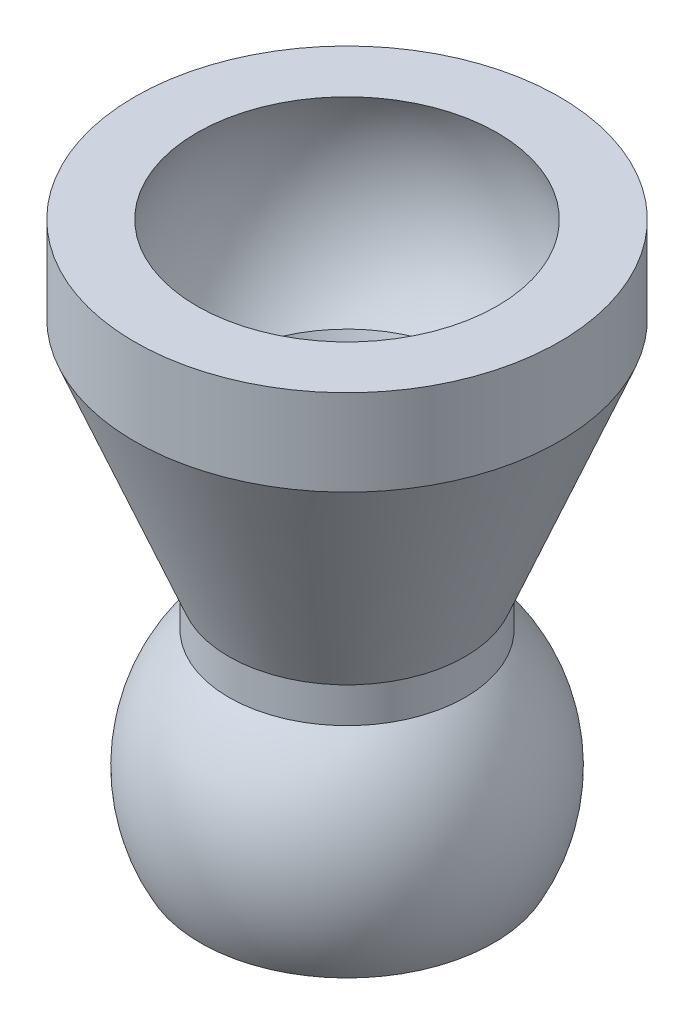
ISO-10303-21;
HEADER;
FILE_DESCRIPTION(('STEP AP214'),'2;1');
FILE_NAME('part.step','',(''),(''),'','','');
FILE_SCHEMA(('AUTOMOTIVE_DESIGN { 1 0 10303 214 1 1 1 1 }'));
ENDSEC;
DATA;
#1=APPLICATION_CONTEXT('core data for automotive mechanical design processes');
#2=APPLICATION_PROTOCOL_DEFINITION('international standard','automotive_design',2000,#1);
#3=PRODUCT_CONTEXT('',#1,'mechanical');
#4=PRODUCT('Part','Part','',(#3));
#5=PRODUCT_RELATED_PRODUCT_CATEGORY('part','',(#4));
#6=PRODUCT_DEFINITION_FORMATION('','',#4);
#7=PRODUCT_DEFINITION_CONTEXT('part definition',#1,'design');
#8=PRODUCT_DEFINITION('design','',#6,#7);
#9=PRODUCT_DEFINITION_SHAPE('','',#8);
#10=(LENGTH_UNIT() NAMED_UNIT(*) SI_UNIT(.MILLI.,.METRE.));
#11=(NAMED_UNIT(*) PLANE_ANGLE_UNIT() SI_UNIT($,.RADIAN.));
#12=(NAMED_UNIT(*) SI_UNIT($,.STERADIAN.) SOLID_ANGLE_UNIT());
#13=UNCERTAINTY_MEASURE_WITH_UNIT(LENGTH_MEASURE(1.E-05),#10,'distance_accuracy_value','');
#14=(GEOMETRIC_REPRESENTATION_CONTEXT(3) GLOBAL_UNCERTAINTY_ASSIGNED_CONTEXT((#13)) GLOBAL_UNIT_ASSIGNED_CONTEXT((#10,
#11,#12)) REPRESENTATION_CONTEXT('',''));
#15=CARTESIAN_POINT('',(0.,0.,0.));
#16=DIRECTION('',(0.,0.,1.));
#17=DIRECTION('',(1.,0.,0.));
#18=AXIS2_PLACEMENT_3D('',#15,#16,#17);
#19=CARTESIAN_POINT('',(7.81370670429727,-2.626137876352,0.));
#20=DIRECTION('',(0.,1.,0.));
#21=DIRECTION('',(-1.,0.,0.));
#22=AXIS2_PLACEMENT_3D('',#19,#20,#21);
#23=SPHERICAL_SURFACE('',#22,6.11744772114726);
#24=CARTESIAN_POINT('',(7.81370670429727,-6.71411605464475,0.));
#25=DIRECTION('',(0.,1.,0.));
#26=DIRECTION('',(-1.,0.,0.));
#27=AXIS2_PLACEMENT_3D('',#24,#25,#26);
#28=CIRCLE('',#27,4.55100000382027);
#29=CARTESIAN_POINT('',(3.262706700477,-6.71411605464475,0.));
#30=VERTEX_POINT('',#29);
#31=EDGE_CURVE('E75',#30,#30,#28,.T.);
#32=CARTESIAN_POINT('',(7.81370670429727,0.,0.));
#33=DIRECTION('',(0.,1.,0.));
#34=DIRECTION('',(-1.,0.,0.));
#35=AXIS2_PLACEMENT_3D('',#32,#33,#34);
#36=CIRCLE('',#35,5.52508520073303);
#37=CARTESIAN_POINT('',(2.28862150356424,0.,0.));
#38=VERTEX_POINT('',#37);
#39=EDGE_CURVE('E10',#38,#38,#36,.T.);
#40=CARTESIAN_POINT('',(3.262706700477,-6.71411605464475,0.));
#41=CARTESIAN_POINT('',(3.2126473959309,-6.65838781721575,0.));
#42=CARTESIAN_POINT('',(3.16361272046767,-6.60173925418387,0.));
#43=CARTESIAN_POINT('',(3.06765654567042,-6.48667979341083,0.));
#44=CARTESIAN_POINT('',(3.0207350463364,-6.42826889566965,0.));
#45=CARTESIAN_POINT('',(2.92906914176106,-6.30976308197442,0.));
#46=CARTESIAN_POINT('',(2.88432473651973,-6.24966816602038,0.));
#47=CARTESIAN_POINT('',(2.79707323628925,-6.12787554199552,0.));
#48=CARTESIAN_POINT('',(2.75456614130011,-6.06617783392472,0.));
#49=CARTESIAN_POINT('',(2.67184666345918,-5.94126284381493,0.));
#50=CARTESIAN_POINT('',(2.63163428060739,-5.87804556177594,0.));
#51=CARTESIAN_POINT('',(2.55355847760947,-5.75017673812441,0.));
#52=CARTESIAN_POINT('',(2.51569505746334,-5.68552519651187,0.));
#53=CARTESIAN_POINT('',(2.4423682754786,-5.55487509122402,0.));
#54=CARTESIAN_POINT('',(2.40690491364,-5.48887652754871,0.));
#55=CARTESIAN_POINT('',(2.33842610132057,-5.35562143658795,0.));
#56=CARTESIAN_POINT('',(2.30541065083974,-5.28836490930249,0.));
#57=CARTESIAN_POINT('',(2.24187221215591,-5.15268464617665,0.));
#58=CARTESIAN_POINT('',(2.21134922395292,-5.08426091033626,0.));
#59=CARTESIAN_POINT('',(2.15283689716001,-4.94633856041037,0.));
#60=CARTESIAN_POINT('',(2.1248475585701,-4.87683994632486,0.));
#61=CARTESIAN_POINT('',(2.07144029953461,-4.73686162058461,0.));
#62=CARTESIAN_POINT('',(2.04602237908903,-4.66638190892986,0.));
#63=CARTESIAN_POINT('',(1.99779225500887,-4.52453649262653,0.));
#64=CARTESIAN_POINT('',(1.9749800513743,-4.45317078797796,0.));
#65=CARTESIAN_POINT('',(1.93199214346181,-4.30964968580736,0.));
#66=CARTESIAN_POINT('',(1.91181643918389,-4.23749428828534,0.));
#67=CARTESIAN_POINT('',(1.87412875486474,-4.0924911660926,0.));
#68=CARTESIAN_POINT('',(1.85661677482351,-4.01964344142188,0.));
#69=CARTESIAN_POINT('',(1.82428016945707,-3.87335396487503,0.));
#70=CARTESIAN_POINT('',(1.80945554413186,-3.79991221299891,0.));
#71=CARTESIAN_POINT('',(1.78251365238888,-3.65253378355862,0.));
#72=CARTESIAN_POINT('',(1.77039638597111,-3.57859710599445,0.));
#73=CARTESIAN_POINT('',(1.74888556295318,-3.43032859454287,0.));
#74=CARTESIAN_POINT('',(1.73949200635303,-3.35599676065545,0.));
#75=CARTESIAN_POINT('',(1.72344127853551,-3.20703823914189,0.));
#76=CARTESIAN_POINT('',(1.71678410731814,-3.13241155151575,0.));
#77=CARTESIAN_POINT('',(1.7062151333821,-2.98296402298177,0.));
#78=CARTESIAN_POINT('',(1.70230333066344,-2.90814318207394,0.));
#79=CARTESIAN_POINT('',(1.69723037226963,-2.75840830942191,0.));
#80=CARTESIAN_POINT('',(1.69606921659448,-2.68349427767773,0.));
#81=CARTESIAN_POINT('',(1.69649911913915,-2.53367411154927,0.));
#82=CARTESIAN_POINT('',(1.69809017735898,-2.458767977165,0.));
#83=CARTESIAN_POINT('',(1.70402236073522,-2.30906468329529,0.));
#84=CARTESIAN_POINT('',(1.70836348589164,-2.23426752380985,0.));
#85=CARTESIAN_POINT('',(1.71978994527817,-2.08488311022993,0.));
#86=CARTESIAN_POINT('',(1.72687527950828,-2.01029585613545,0.));
#87=CARTESIAN_POINT('',(1.74378059614856,-1.86143190057504,0.));
#88=CARTESIAN_POINT('',(1.75360057855872,-1.7871551991091,0.));
#89=CARTESIAN_POINT('',(1.77596194065094,-1.639012577026,0.));
#90=CARTESIAN_POINT('',(1.78850332033299,-1.56514665640883,0.));
#91=CARTESIAN_POINT('',(1.8162905534982,-1.41792526979444,0.));
#92=CARTESIAN_POINT('',(1.83153640698136,-1.34456980379722,0.));
#93=CARTESIAN_POINT('',(1.86471201615183,-1.1984683119358,0.));
#94=CARTESIAN_POINT('',(1.88264177183914,-1.12572228607161,0.));
#95=CARTESIAN_POINT('',(1.92116098748231,-0.980937835587347,0.));
#96=CARTESIAN_POINT('',(1.94175044743817,-0.908899410967276,0.));
#97=CARTESIAN_POINT('',(1.98556130228268,-0.76562737682872,0.));
#98=CARTESIAN_POINT('',(2.00878269717133,-0.694393767310235,0.));
#99=CARTESIAN_POINT('',(2.05782603544463,-0.552827462949563,0.));
#100=CARTESIAN_POINT('',(2.08364797882928,-0.482494768107376,0.));
#101=CARTESIAN_POINT('',(2.13785776331318,-0.342825282508721,0.));
#102=CARTESIAN_POINT('',(2.16624560441242,-0.273488491752253,0.));
#103=CARTESIAN_POINT('',(2.22554815751394,-0.135904066068437,0.));
#104=CARTESIAN_POINT('',(2.25646286951622,-0.0676564311410887,0.));
#105=CARTESIAN_POINT('',(2.28862150356424,0.,0.));
#106=B_SPLINE_CURVE_WITH_KNOTS('',3,(#40,#41,#42,#43,#44,#45,#46,#47,#48,#49,#50,#51,#52,#53,
#54,#55,#56,#57,#58,#59,#60,#61,#62,#63,#64,#65,#66,#67,#68,#69,#70,#71,#72,#73,#74,#75,#76,#77,
#78,#79,#80,#81,#82,#83,#84,#85,#86,#87,#88,#89,#90,#91,#92,#93,#94,#95,#96,#97,#98,#99,#100,
#101,#102,#103,#104,#105),.UNSPECIFIED.,.F.,.F.,(4,2,2,2,2,2,2,2,2,2,2,2,2,2,2,2,2,2,2,2,2,2,2,
2,2,2,2,2,2,2,2,2,4),(0.,0.224718540036753,0.449437080073506,0.67415562011026,0.898874160147011,
1.12359270018377,1.34831124022052,1.57302978025727,1.79774832029402,2.02246686033078,
2.24718540036753,2.47190394040428,2.69662248044104,2.92134102047779,3.14605956051454,
3.37077810055129,3.59549664058805,3.8202151806248,4.04493372066155,4.26965226069831,
4.49437080073506,4.71908934077181,4.94380788080857,5.16852642084532,5.39324496088207,
5.61796350091883,5.84268204095558,6.06740058099233,6.29211912102908,6.51683766106584,
6.74155620110259,6.96627474113934,7.19099328117609),.UNSPECIFIED.);
#107=EDGE_CURVE('BSEAM32',#30,#38,#106,.T.);
#108=ORIENTED_EDGE('',*,*,#31,.F.);
#109=ORIENTED_EDGE('',*,*,#39,.T.);
#110=ORIENTED_EDGE('',*,*,#107,.T.);
#111=ORIENTED_EDGE('',*,*,#107,.F.);
#112=EDGE_LOOP('',(#108,#110,#109,#111));
#113=FACE_BOUND('',#112,.T.);
#114=ADVANCED_FACE('F32',(#113),#23,.F.);
#115=CARTESIAN_POINT('',(7.81370670429727,0.,0.));
#116=DIRECTION('',(0.,-1.,0.));
#117=DIRECTION('',(1.,0.,0.));
#118=AXIS2_PLACEMENT_3D('',#115,#116,#117);
#119=PLANE('',#118);
#120=ORIENTED_EDGE('',*,*,#39,.F.);
#121=EDGE_LOOP('',(#120));
#122=FACE_BOUND('',#121,.T.);
#123=CARTESIAN_POINT('',(7.81370670429727,0.,0.));
#124=DIRECTION('',(0.,1.,0.));
#125=DIRECTION('',(-1.,0.,0.));
#126=AXIS2_PLACEMENT_3D('',#123,#124,#125);
#127=CIRCLE('',#126,7.81370670429727);
#128=CARTESIAN_POINT('',(0.,0.,0.));
#129=VERTEX_POINT('',#128);
#130=EDGE_CURVE('E38',#129,#129,#127,.T.);
#131=ORIENTED_EDGE('',*,*,#130,.T.);
#132=EDGE_LOOP('',(#131));
#133=FACE_BOUND('',#132,.T.);
#134=ADVANCED_FACE('F83',(#122,#133),#119,.F.);
#135=CARTESIAN_POINT('',(7.81370670429727,0.,0.));
#136=DIRECTION('',(0.,1.,0.));
#137=DIRECTION('',(-1.,0.,0.));
#138=AXIS2_PLACEMENT_3D('',#135,#136,#137);
#139=CYLINDRICAL_SURFACE('',#138,7.81370670429727);
#140=CARTESIAN_POINT('',(7.81370670429727,-3.17,0.));
#141=DIRECTION('',(0.,1.,0.));
#142=DIRECTION('',(-1.,0.,0.));
#143=AXIS2_PLACEMENT_3D('',#140,#141,#142);
#144=CIRCLE('',#143,7.81370670429727);
#145=CARTESIAN_POINT('',(0.,-3.17,0.));
#146=VERTEX_POINT('',#145);
#147=EDGE_CURVE('E42',#146,#146,#144,.T.);
#148=ORIENTED_EDGE('',*,*,#147,.T.);
#149=EDGE_LOOP('',(#148));
#150=FACE_BOUND('',#149,.T.);
#151=ORIENTED_EDGE('',*,*,#130,.F.);
#152=EDGE_LOOP('',(#151));
#153=FACE_BOUND('',#152,.T.);
#154=ADVANCED_FACE('F87',(#150,#153),#139,.T.);
#155=CARTESIAN_POINT('',(7.81370670429727,-3.17,0.));
#156=DIRECTION('',(0.,1.,0.));
#157=DIRECTION('',(-1.,0.,0.));
#158=AXIS2_PLACEMENT_3D('',#155,#156,#157);
#159=CONICAL_SURFACE('',#158,7.81370670429727,0.38341334566811);
#160=CARTESIAN_POINT('',(7.81370670429727,-11.76,0.));
#161=DIRECTION('',(0.,1.,0.));
#162=DIRECTION('',(-1.,0.,0.));
#163=AXIS2_PLACEMENT_3D('',#160,#161,#162);
#164=CIRCLE('',#163,4.34870670429727);
#165=CARTESIAN_POINT('',(3.465,-11.76,0.));
#166=VERTEX_POINT('',#165);
#167=EDGE_CURVE('E46',#166,#166,#164,.T.);
#168=ORIENTED_EDGE('',*,*,#167,.T.);
#169=EDGE_LOOP('',(#168));
#170=FACE_BOUND('',#169,.T.);
#171=ORIENTED_EDGE('',*,*,#147,.F.);
#172=EDGE_LOOP('',(#171));
#173=FACE_BOUND('',#172,.T.);
#174=ADVANCED_FACE('F92',(#170,#173),#159,.T.);
#175=CARTESIAN_POINT('',(7.81370670429727,0.,0.));
#176=DIRECTION('',(0.,1.,0.));
#177=DIRECTION('',(-1.,0.,0.));
#178=AXIS2_PLACEMENT_3D('',#175,#176,#177);
#179=CYLINDRICAL_SURFACE('',#178,4.34870670429727);
#180=CARTESIAN_POINT('',(7.81370670429727,-13.06,0.));
#181=DIRECTION('',(0.,1.,0.));
#182=DIRECTION('',(-1.,0.,0.));
#183=AXIS2_PLACEMENT_3D('',#180,#181,#182);
#184=CIRCLE('',#183,4.34870670429727);
#185=CARTESIAN_POINT('',(3.465,-13.06,0.));
#186=VERTEX_POINT('',#185);
#187=EDGE_CURVE('E51',#186,#186,#184,.T.);
#188=ORIENTED_EDGE('',*,*,#187,.T.);
#189=EDGE_LOOP('',(#188));
#190=FACE_BOUND('',#189,.T.);
#191=ORIENTED_EDGE('',*,*,#167,.F.);
#192=EDGE_LOOP('',(#191));
#193=FACE_BOUND('',#192,.T.);
#194=ADVANCED_FACE('F98',(#190,#193),#179,.T.);
#195=CARTESIAN_POINT('',(7.81370670429727,-17.4087067042973,0.));
#196=DIRECTION('',(0.,1.,0.));
#197=DIRECTION('',(-1.,0.,0.));
#198=AXIS2_PLACEMENT_3D('',#195,#196,#197);
#199=SPHERICAL_SURFACE('',#198,6.15);
#200=CARTESIAN_POINT('',(7.81370670429727,-20.36,0.));
#201=DIRECTION('',(0.,1.,0.));
#202=DIRECTION('',(-1.,0.,0.));
#203=AXIS2_PLACEMENT_3D('',#200,#201,#202);
#204=CIRCLE('',#203,5.39558781623839);
#205=CARTESIAN_POINT('',(2.41811888805889,-20.36,0.));
#206=VERTEX_POINT('',#205);
#207=EDGE_CURVE('E54',#206,#206,#204,.T.);
#208=CARTESIAN_POINT('',(2.41811888805889,-20.36,0.));
#209=CARTESIAN_POINT('',(2.37858539678171,-20.2877264222879,0.));
#210=CARTESIAN_POINT('',(2.3405057580154,-20.2146576885072,0.));
#211=CARTESIAN_POINT('',(2.26731189352244,-20.0670497596736,0.));
#212=CARTESIAN_POINT('',(2.23219766779578,-19.9925105646206,0.));
#213=CARTESIAN_POINT('',(2.16499233740006,-19.8420815641071,0.));
#214=CARTESIAN_POINT('',(2.13290123273099,-19.7661917586465,0.));
#215=CARTESIAN_POINT('',(2.07179368832543,-19.6131842050831,0.));
#216=CARTESIAN_POINT('',(2.04277724858893,-19.5360664569801,0.));
#217=CARTESIAN_POINT('',(1.9878659572672,-19.3807274980969,0.));
#218=CARTESIAN_POINT('',(1.96197110568198,-19.3025062873166,0.));
#219=CARTESIAN_POINT('',(1.91334478158619,-19.145086710394,0.));
#220=CARTESIAN_POINT('',(1.89061330907563,-19.0658883442516,0.));
#221=CARTESIAN_POINT('',(1.8483504510733,-18.9066423294178,0.));
#222=CARTESIAN_POINT('',(1.82881906558154,-18.8265946807262,0.));
#223=CARTESIAN_POINT('',(1.79298791601775,-18.6657793481561,0.));
#224=CARTESIAN_POINT('',(1.77668815194573,-18.5850116642775,0.));
#225=CARTESIAN_POINT('',(1.74734656354838,-18.4228866704013,0.));
#226=CARTESIAN_POINT('',(1.73430473922306,-18.3415293604036,0.));
#227=CARTESIAN_POINT('',(1.71150008783109,-18.1783564756156,0.));
#228=CARTESIAN_POINT('',(1.70173726076445,-18.0965409008253,0.));
#229=CARTESIAN_POINT('',(1.68550636718901,-17.9325835876397,0.));
#230=CARTESIAN_POINT('',(1.67903830068021,-17.8504418492445,0.));
#231=CARTESIAN_POINT('',(1.66940737169366,-17.6859648366844,0.));
#232=CARTESIAN_POINT('',(1.66624450921592,-17.6036295625195,0.));
#233=CARTESIAN_POINT('',(1.66322909511975,-17.4388984187382,0.));
#234=CARTESIAN_POINT('',(1.66337654350133,-17.3565025491217,0.));
#235=CARTESIAN_POINT('',(1.66698151304994,-17.1917832525949,0.));
#236=CARTESIAN_POINT('',(1.67043903421697,-17.1094598256846,0.));
#237=CARTESIAN_POINT('',(1.68065856674797,-16.9450183357601,0.));
#238=CARTESIAN_POINT('',(1.68742057811195,-16.862900272746,0.));
#239=CARTESIAN_POINT('',(1.70423817294665,-16.699002100219,0.));
#240=CARTESIAN_POINT('',(1.71429375641737,-16.6172219907061,0.));
#241=CARTESIAN_POINT('',(1.73768225950248,-16.4541317691195,0.));
#242=CARTESIAN_POINT('',(1.75101517911686,-16.3728216570459,0.));
#243=CARTESIAN_POINT('',(1.78093682686818,-16.2108027154077,0.));
#244=CARTESIAN_POINT('',(1.79752555500511,-16.1300938858431,0.));
#245=CARTESIAN_POINT('',(1.83393203528144,-15.9694078234494,0.));
#246=CARTESIAN_POINT('',(1.85374978742083,-15.8894305906202,0.));
#247=CARTESIAN_POINT('',(1.89658231752966,-15.7303368546712,0.));
#248=CARTESIAN_POINT('',(1.9195970954991,-15.6512203515514,0.));
#249=CARTESIAN_POINT('',(1.96878651710892,-15.493975818243,0.));
#250=CARTESIAN_POINT('',(1.99496116074931,-15.4158477880544,0.));
#251=CARTESIAN_POINT('',(2.0504280515523,-15.2607063478184,0.));
#252=CARTESIAN_POINT('',(2.07972029871491,-15.1836929377711,0.));
#253=CARTESIAN_POINT('',(2.14137510067087,-15.0309050853447,0.));
#254=CARTESIAN_POINT('',(2.17373765546423,-14.9551306429657,0.));
#255=CARTESIAN_POINT('',(2.24148081937696,-14.8049430729133,0.));
#256=CARTESIAN_POINT('',(2.27686142849634,-14.73052994524,0.));
#257=CARTESIAN_POINT('',(2.35058357484484,-14.5831851537242,0.));
#258=CARTESIAN_POINT('',(2.38892511207395,-14.5102534898818,0.));
#259=CARTESIAN_POINT('',(2.46850720725738,-14.3659893827903,0.));
#260=CARTESIAN_POINT('',(2.50974776521169,-14.2946569395412,0.));
#261=CARTESIAN_POINT('',(2.59506131509292,-14.1537064496035,0.));
#262=CARTESIAN_POINT('',(2.63913430701984,-14.084088402915,0.));
#263=CARTESIAN_POINT('',(2.73004155935924,-13.9466791089584,0.));
#264=CARTESIAN_POINT('',(2.77687581977173,-13.8788878616903,0.));
#265=CARTESIAN_POINT('',(2.87323000543819,-13.7452416385259,0.));
#266=CARTESIAN_POINT('',(2.92274993069216,-13.6793866626296,0.));
#267=CARTESIAN_POINT('',(3.02439543050226,-13.5497192580936,0.));
#268=CARTESIAN_POINT('',(3.07652100505839,-13.4859068294538,0.));
#269=CARTESIAN_POINT('',(3.18329386279894,-13.3604277575772,0.));
#270=CARTESIAN_POINT('',(3.23794114598336,-13.2987611143404,0.));
#271=CARTESIAN_POINT('',(3.34966835625048,-13.1776724156939,0.));
#272=CARTESIAN_POINT('',(3.40674828333318,-13.1182503602842,0.));
#273=CARTESIAN_POINT('',(3.465,-13.06,0.));
#274=B_SPLINE_CURVE_WITH_KNOTS('',3,(#208,#209,#210,#211,#212,#213,#214,#215,#216,#217,#218,
#219,#220,#221,#222,#223,#224,#225,#226,#227,#228,#229,#230,#231,#232,#233,#234,#235,#236,#237,
#238,#239,#240,#241,#242,#243,#244,#245,#246,#247,#248,#249,#250,#251,#252,#253,#254,#255,#256,
#257,#258,#259,#260,#261,#262,#263,#264,#265,#266,#267,#268,#269,#270,#271,#272,#273),
.UNSPECIFIED.,.F.,.F.,(4,2,2,2,2,2,2,2,2,2,2,2,2,2,2,2,2,2,2,2,2,2,2,2,2,2,2,2,2,2,2,2,4),(0.,
0.247121485454674,0.494242970909352,0.741364456364027,0.9884859418187,1.23560742727338,
1.48272891272805,1.72985039818273,1.9769718836374,2.22409336909208,2.47121485454675,
2.71833634000143,2.96545782545611,3.21257931091078,3.45970079636546,3.70682228182013,
3.95394376727481,4.20106525272948,4.44818673818416,4.69530822363884,4.94242970909351,
5.18955119454819,5.43667268000286,5.68379416545754,5.93091565091221,6.17803713636689,
6.42515862182156,6.67228010727624,6.91940159273092,7.16652307818559,7.41364456364027,
7.66076604909494,7.90788753454962),.UNSPECIFIED.);
#275=EDGE_CURVE('BSEAM102',#206,#186,#274,.T.);
#276=ORIENTED_EDGE('',*,*,#207,.T.);
#277=ORIENTED_EDGE('',*,*,#187,.F.);
#278=ORIENTED_EDGE('',*,*,#275,.T.);
#279=ORIENTED_EDGE('',*,*,#275,.F.);
#280=EDGE_LOOP('',(#276,#278,#277,#279));
#281=FACE_BOUND('',#280,.T.);
#282=ADVANCED_FACE('F102',(#281),#199,.T.);
#283=CARTESIAN_POINT('',(7.81370670429727,-20.36,0.));
#284=DIRECTION('',(0.,-1.,0.));
#285=DIRECTION('',(1.,0.,0.));
#286=AXIS2_PLACEMENT_3D('',#283,#284,#285);
#287=PLANE('',#286);
#288=CARTESIAN_POINT('',(7.81370670429727,-20.36,0.));
#289=DIRECTION('',(0.,1.,0.));
#290=DIRECTION('',(-1.,0.,0.));
#291=AXIS2_PLACEMENT_3D('',#288,#289,#290);
#292=CIRCLE('',#291,3.45789347114128);
#293=CARTESIAN_POINT('',(4.35581323315599,-20.36,0.));
#294=VERTEX_POINT('',#293);
#295=EDGE_CURVE('E57',#294,#294,#292,.T.);
#296=ORIENTED_EDGE('',*,*,#295,.T.);
#297=EDGE_LOOP('',(#296));
#298=FACE_BOUND('',#297,.T.);
#299=ORIENTED_EDGE('',*,*,#207,.F.);
#300=EDGE_LOOP('',(#299));
#301=FACE_BOUND('',#300,.T.);
#302=ADVANCED_FACE('F106',(#298,#301),#287,.T.);
#303=CARTESIAN_POINT('',(7.81370670429727,-19.5441953491553,0.));
#304=DIRECTION('',(0.,1.,0.));
#305=DIRECTION('',(-1.,0.,0.));
#306=AXIS2_PLACEMENT_3D('',#303,#304,#305);
#307=CONICAL_SURFACE('',#306,3.90412451744078,0.500523729527405);
#308=ORIENTED_EDGE('',*,*,#295,.F.);
#309=EDGE_LOOP('',(#308));
#310=FACE_BOUND('',#309,.T.);
#311=CARTESIAN_POINT('',(7.81370670429727,-19.5441953491553,0.));
#312=DIRECTION('',(0.,1.,0.));
#313=DIRECTION('',(-1.,0.,0.));
#314=AXIS2_PLACEMENT_3D('',#311,#312,#313);
#315=CIRCLE('',#314,3.90412451744078);
#316=CARTESIAN_POINT('',(3.90958218685649,-19.5441953491553,0.));
#317=VERTEX_POINT('',#316);
#318=EDGE_CURVE('E60',#317,#317,#315,.T.);
#319=ORIENTED_EDGE('',*,*,#318,.T.);
#320=EDGE_LOOP('',(#319));
#321=FACE_BOUND('',#320,.T.);
#322=ADVANCED_FACE('F110',(#310,#321),#307,.F.);
#323=CARTESIAN_POINT('',(7.81370670429727,-17.4087067042973,0.));
#324=DIRECTION('',(0.,1.,0.));
#325=DIRECTION('',(-1.,0.,0.));
#326=AXIS2_PLACEMENT_3D('',#323,#324,#325);
#327=SPHERICAL_SURFACE('',#326,4.45);
#328=CARTESIAN_POINT('',(7.81370670429727,-18.3527670837222,0.));
#329=DIRECTION('',(0.,1.,0.));
#330=DIRECTION('',(-1.,0.,0.));
#331=AXIS2_PLACEMENT_3D('',#328,#329,#330);
#332=CIRCLE('',#331,4.34870670429727);
#333=CARTESIAN_POINT('',(3.465,-18.3527670837222,0.));
#334=VERTEX_POINT('',#333);
#335=EDGE_CURVE('E63',#334,#334,#332,.T.);
#336=CARTESIAN_POINT('',(3.90958218685649,-19.5441953491553,0.));
#337=CARTESIAN_POINT('',(3.90320350633358,-19.5325337767858,0.));
#338=CARTESIAN_POINT('',(3.89687707825183,-19.5208436232642,0.));
#339=CARTESIAN_POINT('',(3.88432922832235,-19.4974070961775,0.));
#340=CARTESIAN_POINT('',(3.87810780647463,-19.4856607226123,0.));
#341=CARTESIAN_POINT('',(3.8657704703649,-19.4621126976985,0.));
#342=CARTESIAN_POINT('',(3.85965455610289,-19.4503110463499,0.));
#343=CARTESIAN_POINT('',(3.84752872578492,-19.4266534137781,0.));
#344=CARTESIAN_POINT('',(3.84151880972895,-19.4147974325548,0.));
#345=CARTESIAN_POINT('',(3.82960545853726,-19.3910320921807,0.));
#346=CARTESIAN_POINT('',(3.82370202340154,-19.3791227330298,0.));
#347=CARTESIAN_POINT('',(3.81200210805212,-19.3552515931206,0.));
#348=CARTESIAN_POINT('',(3.80620562783841,-19.3432898123622,0.));
#349=CARTESIAN_POINT('',(3.79472008778993,-19.3193147897443,0.));
#350=CARTESIAN_POINT('',(3.78903102795516,-19.3073015478846,0.));
#351=CARTESIAN_POINT('',(3.77776078548414,-19.2832245677088,0.));
#352=CARTESIAN_POINT('',(3.7721796028479,-19.2711608293926,0.));
#353=CARTESIAN_POINT('',(3.76112556293432,-19.2469838250015,0.));
#354=CARTESIAN_POINT('',(3.75565270565697,-19.2348705589266,0.));
#355=CARTESIAN_POINT('',(3.74481575592234,-19.2105954716931,0.));
#356=CARTESIAN_POINT('',(3.73945166346506,-19.1984336505347,0.));
#357=CARTESIAN_POINT('',(3.72883267409834,-19.1740624297082,0.));
#358=CARTESIAN_POINT('',(3.7235777771889,-19.1618530300403,0.));
#359=CARTESIAN_POINT('',(3.71317760087733,-19.1373876325894,0.));
#360=CARTESIAN_POINT('',(3.70803232147521,-19.1251316348065,0.));
#361=CARTESIAN_POINT('',(3.69785179333569,-19.100574025262,0.));
#362=CARTESIAN_POINT('',(3.69281654459828,-19.0882724135004,0.));
#363=CARTESIAN_POINT('',(3.6828564821103,-19.0636245637975,0.));
#364=CARTESIAN_POINT('',(3.67793166835973,-19.0512783258562,0.));
#365=CARTESIAN_POINT('',(3.66819287129978,-19.0265422151763,0.));
#366=CARTESIAN_POINT('',(3.66337888799041,-19.0141523424378,0.));
#367=CARTESIAN_POINT('',(3.65386213836772,-18.9893299570496,0.));
#368=CARTESIAN_POINT('',(3.64915937205441,-18.9768974444,0.));
#369=CARTESIAN_POINT('',(3.63986543404819,-18.9519907774998,0.));
#370=CARTESIAN_POINT('',(3.63527426235528,-18.9395166232492,0.));
#371=CARTESIAN_POINT('',(3.62620388225331,-18.914527674801,0.));
#372=CARTESIAN_POINT('',(3.62172467384426,-18.9020128806034,0.));
#373=CARTESIAN_POINT('',(3.61287857998301,-18.8769436571783,0.));
#374=CARTESIAN_POINT('',(3.60851169453081,-18.8643892279508,0.));
#375=CARTESIAN_POINT('',(3.59989059723693,-18.8392417425657,0.));
#376=CARTESIAN_POINT('',(3.59563638539524,-18.8266486864082,0.));
#377=CARTESIAN_POINT('',(3.58724097692853,-18.8014249583646,0.));
#378=CARTESIAN_POINT('',(3.5830997803035,-18.7887942864785,0.));
#379=CARTESIAN_POINT('',(3.57493073480131,-18.7634963411998,0.));
#380=CARTESIAN_POINT('',(3.57090288592416,-18.7508290678072,0.));
#381=CARTESIAN_POINT('',(3.5629608593473,-18.7254589366764,0.));
#382=CARTESIAN_POINT('',(3.5590466816476,-18.7127560789383,0.));
#383=CARTESIAN_POINT('',(3.55133231172759,-18.6873157991348,0.));
#384=CARTESIAN_POINT('',(3.54753211950727,-18.6745783770695,0.));
#385=CARTESIAN_POINT('',(3.54004602569533,-18.6490699914056,0.));
#386=CARTESIAN_POINT('',(3.53636012410372,-18.636299027807,0.));
#387=CARTESIAN_POINT('',(3.52910290752023,-18.6107245845637,0.));
#388=CARTESIAN_POINT('',(3.52553159252836,-18.5979211049191,0.));
#389=CARTESIAN_POINT('',(3.51850383591777,-18.5722826576814,0.));
#390=CARTESIAN_POINT('',(3.51504739429904,-18.5594476900883,0.));
#391=CARTESIAN_POINT('',(3.50824966197108,-18.5337472975826,0.));
#392=CARTESIAN_POINT('',(3.50490837126185,-18.52088187267,0.));
#393=CARTESIAN_POINT('',(3.49834120909091,-18.4951215985888,0.));
#394=CARTESIAN_POINT('',(3.4951153376292,-18.4822267494203,0.));
#395=CARTESIAN_POINT('',(3.4887792728439,-18.4564086622944,0.));
#396=CARTESIAN_POINT('',(3.4856690795203,-18.4434854243371,0.));
#397=CARTESIAN_POINT('',(3.47956462128278,-18.4176115972284,0.));
#398=CARTESIAN_POINT('',(3.47657035636885,-18.4046610080771,0.));
#399=CARTESIAN_POINT('',(3.47069799341391,-18.3787335189378,0.));
#400=CARTESIAN_POINT('',(3.46781989537291,-18.3657566189499,0.));
#401=CARTESIAN_POINT('',(3.465,-18.3527670837222,0.));
#402=B_SPLINE_CURVE_WITH_KNOTS('',3,(#336,#337,#338,#339,#340,#341,#342,#343,#344,#345,#346,
#347,#348,#349,#350,#351,#352,#353,#354,#355,#356,#357,#358,#359,#360,#361,#362,#363,#364,#365,
#366,#367,#368,#369,#370,#371,#372,#373,#374,#375,#376,#377,#378,#379,#380,#381,#382,#383,#384,
#385,#386,#387,#388,#389,#390,#391,#392,#393,#394,#395,#396,#397,#398,#399,#400,#401),
.UNSPECIFIED.,.F.,.F.,(4,2,2,2,2,2,2,2,2,2,2,2,2,2,2,2,2,2,2,2,2,2,2,2,2,2,2,2,2,2,2,2,4),(0.,
0.0398761567125613,0.0797523134251228,0.119628470137688,0.159504626850248,0.199380783562811,
0.239256940275374,0.279133096987937,0.319009253700498,0.358885410413063,0.398761567125625,
0.438637723838186,0.478513880550751,0.518390037263312,0.558266193975876,0.598142350688438,
0.638018507401,0.677894664113564,0.717770820826125,0.757646977538688,0.79752313425125,
0.837399290963813,0.877275447676377,0.91715160438894,0.957027761101501,0.996903917814064,
1.03678007452663,1.07665623123919,1.11653238795175,1.15640854466432,1.19628470137688,
1.23616085808944,1.276037014802),.UNSPECIFIED.);
#403=EDGE_CURVE('BSEAM114',#317,#334,#402,.T.);
#404=ORIENTED_EDGE('',*,*,#318,.F.);
#405=ORIENTED_EDGE('',*,*,#335,.T.);
#406=ORIENTED_EDGE('',*,*,#403,.T.);
#407=ORIENTED_EDGE('',*,*,#403,.F.);
#408=EDGE_LOOP('',(#404,#406,#405,#407));
#409=FACE_BOUND('',#408,.T.);
#410=ADVANCED_FACE('F114',(#409),#327,.F.);
#411=CARTESIAN_POINT('',(7.81370670429727,0.,0.));
#412=DIRECTION('',(0.,1.,0.));
#413=DIRECTION('',(-1.,0.,0.));
#414=AXIS2_PLACEMENT_3D('',#411,#412,#413);
#415=CYLINDRICAL_SURFACE('',#414,4.34870670429727);
#416=ORIENTED_EDGE('',*,*,#335,.F.);
#417=EDGE_LOOP('',(#416));
#418=FACE_BOUND('',#417,.T.);
#419=CARTESIAN_POINT('',(7.81370670429727,-16.4646463248723,0.));
#420=DIRECTION('',(0.,1.,0.));
#421=DIRECTION('',(-1.,0.,0.));
#422=AXIS2_PLACEMENT_3D('',#419,#420,#421);
#423=CIRCLE('',#422,4.34870670429727);
#424=CARTESIAN_POINT('',(3.465,-16.4646463248723,0.));
#425=VERTEX_POINT('',#424);
#426=EDGE_CURVE('E66',#425,#425,#423,.T.);
#427=ORIENTED_EDGE('',*,*,#426,.T.);
#428=EDGE_LOOP('',(#427));
#429=FACE_BOUND('',#428,.T.);
#430=ADVANCED_FACE('F118',(#418,#429),#415,.F.);
#431=CARTESIAN_POINT('',(7.81370670429727,-17.4087067042973,0.));
#432=DIRECTION('',(0.,1.,0.));
#433=DIRECTION('',(-1.,0.,0.));
#434=AXIS2_PLACEMENT_3D('',#431,#432,#433);
#435=SPHERICAL_SURFACE('',#434,4.45);
#436=CARTESIAN_POINT('',(7.81370670429727,-13.8328357901547,0.));
#437=DIRECTION('',(0.,1.,0.));
#438=DIRECTION('',(-1.,0.,0.));
#439=AXIS2_PLACEMENT_3D('',#436,#437,#438);
#440=CIRCLE('',#439,2.64870670429727);
#441=CARTESIAN_POINT('',(5.165,-13.8328357901547,0.));
#442=VERTEX_POINT('',#441);
#443=EDGE_CURVE('E69',#442,#442,#440,.T.);
#444=CARTESIAN_POINT('',(3.465,-16.4646463248723,0.));
#445=CARTESIAN_POINT('',(3.47207537410115,-16.4320540984782,0.));
#446=CARTESIAN_POINT('',(3.47951728105293,-16.3995414453826,0.));
#447=CARTESIAN_POINT('',(3.49513010803678,-16.3346916513564,0.));
#448=CARTESIAN_POINT('',(3.50330102806886,-16.3023545104257,0.));
#449=CARTESIAN_POINT('',(3.52036782859232,-16.2378721062967,0.));
#450=CARTESIAN_POINT('',(3.5292637090837,-16.2057268430985,0.));
#451=CARTESIAN_POINT('',(3.54777591268249,-16.1416444392321,0.));
#452=CARTESIAN_POINT('',(3.55739223578991,-16.1097072985639,0.));
#453=CARTESIAN_POINT('',(3.57734046904387,-16.0460572857171,0.));
#454=CARTESIAN_POINT('',(3.58767237919042,-16.0143444135383,0.));
#455=CARTESIAN_POINT('',(3.60904656211818,-15.9511589685522,0.));
#456=CARTESIAN_POINT('',(3.62008883489938,-15.9196863957448,0.));
#457=CARTESIAN_POINT('',(3.64287816149469,-15.8569974593664,0.));
#458=CARTESIAN_POINT('',(3.65462521530878,-15.8257810957955,0.));
#459=CARTESIAN_POINT('',(3.67881816558369,-15.7636203581156,0.));
#460=CARTESIAN_POINT('',(3.6912640620445,-15.7326759840066,0.));
#461=CARTESIAN_POINT('',(3.71684840608959,-15.6710748680153,0.));
#462=CARTESIAN_POINT('',(3.72998685367388,-15.6404181261329,0.));
#463=CARTESIAN_POINT('',(3.75694965831313,-15.5794077719487,0.));
#464=CARTESIAN_POINT('',(3.77077401536808,-15.5490541596469,0.));
#465=CARTESIAN_POINT('',(3.79910165057008,-15.4886654087447,0.));
#466=CARTESIAN_POINT('',(3.81360492871713,-15.4586302701443,0.));
#467=CARTESIAN_POINT('',(3.8432830745192,-15.3988936497727,0.));
#468=CARTESIAN_POINT('',(3.85845794217423,-15.3691921680014,0.));
#469=CARTESIAN_POINT('',(3.88947159591225,-15.3101378757485,0.));
#470=CARTESIAN_POINT('',(3.90531038199523,-15.2807850652669,0.));
#471=CARTESIAN_POINT('',(3.93764386589005,-15.2224429537959,0.));
#472=CARTESIAN_POINT('',(3.95413856370189,-15.1934536528065,0.));
#473=CARTESIAN_POINT('',(3.98777553278406,-15.1358532147645,0.));
#474=CARTESIAN_POINT('',(4.00491780405438,-15.1072420777117,0.));
#475=CARTESIAN_POINT('',(4.03984125442684,-15.0504124308207,0.));
#476=CARTESIAN_POINT('',(4.05762243352897,-15.0221939209825,0.));
#477=CARTESIAN_POINT('',(4.09381471096272,-14.9661637933204,0.));
#478=CARTESIAN_POINT('',(4.11222580929433,-14.9383521754966,0.));
#479=CARTESIAN_POINT('',(4.14966861815286,-14.8831498909745,0.));
#480=CARTESIAN_POINT('',(4.16870032867978,-14.8557592242762,0.));
#481=CARTESIAN_POINT('',(4.20737474116772,-14.8014126883205,0.));
#482=CARTESIAN_POINT('',(4.22701744312875,-14.7744568190631,0.));
#483=CARTESIAN_POINT('',(4.26690390886013,-14.7209935045088,0.));
#484=CARTESIAN_POINT('',(4.28714767263048,-14.6944860592119,0.));
#485=CARTESIAN_POINT('',(4.32822602851168,-14.641932992415,0.));
#486=CARTESIAN_POINT('',(4.34906062062253,-14.6158873709148,0.));
#487=CARTESIAN_POINT('',(4.39131010104487,-14.5642711180896,0.));
#488=CARTESIAN_POINT('',(4.41272498935636,-14.5387004867645,0.));
#489=CARTESIAN_POINT('',(4.45612423669379,-14.4880471405551,0.));
#490=CARTESIAN_POINT('',(4.47810859571972,-14.4629644256708,0.));
#491=CARTESIAN_POINT('',(4.52263567112382,-14.4132995919586,0.));
#492=CARTESIAN_POINT('',(4.54517838750197,-14.3887174731309,0.));
#493=CARTESIAN_POINT('',(4.59081078199801,-14.3400662580982,0.));
#494=CARTESIAN_POINT('',(4.6139004601159,-14.3159971618933,0.));
#495=CARTESIAN_POINT('',(4.66061510596006,-14.268384159304,0.));
#496=CARTESIAN_POINT('',(4.68424007368633,-14.2448402529196,0.));
#497=CARTESIAN_POINT('',(4.73201335610653,-14.1982895317896,0.));
#498=CARTESIAN_POINT('',(4.75616167080045,-14.1752827170441,0.));
#499=CARTESIAN_POINT('',(4.80496943963592,-14.1298178090905,0.));
#500=CARTESIAN_POINT('',(4.82962889377748,-14.1073597158825,0.));
#501=CARTESIAN_POINT('',(4.87944647679903,-14.0630036050605,0.));
#502=CARTESIAN_POINT('',(4.90460460567903,-14.0411055874466,0.));
#503=CARTESIAN_POINT('',(4.95540681691105,-13.9978806929838,0.));
#504=CARTESIAN_POINT('',(4.98105089926307,-13.976553816135,0.));
#505=CARTESIAN_POINT('',(5.03281206720361,-13.9344820011541,0.));
#506=CARTESIAN_POINT('',(5.05892915279213,-13.913737063022,0.));
#507=CARTESIAN_POINT('',(5.11162307558719,-13.8728395490127,0.));
#508=CARTESIAN_POINT('',(5.13819991279372,-13.8526869731354,0.));
#509=CARTESIAN_POINT('',(5.165,-13.8328357901547,0.));
#510=B_SPLINE_CURVE_WITH_KNOTS('',3,(#444,#445,#446,#447,#448,#449,#450,#451,#452,#453,#454,
#455,#456,#457,#458,#459,#460,#461,#462,#463,#464,#465,#466,#467,#468,#469,#470,#471,#472,#473,
#474,#475,#476,#477,#478,#479,#480,#481,#482,#483,#484,#485,#486,#487,#488,#489,#490,#491,#492,
#493,#494,#495,#496,#497,#498,#499,#500,#501,#502,#503,#504,#505,#506,#507,#508,#509),
.UNSPECIFIED.,.F.,.F.,(4,2,2,2,2,2,2,2,2,2,2,2,2,2,2,2,2,2,2,2,2,2,2,2,2,2,2,2,2,2,2,2,4),(0.,
0.10005200968907,0.200104019378142,0.300156029067211,0.400208038756281,0.500260048445349,
0.60031205813442,0.700364067823489,0.800416077512558,0.900468087201628,1.0005200968907,
1.10057210657977,1.20062411626884,1.30067612595791,1.40072813564698,1.50078014533605,
1.60083215502512,1.70088416471419,1.80093617440325,1.90098818409232,2.00104019378139,
2.10109220347046,2.20114421315953,2.3011962228486,2.40124823253767,2.50130024222674,
2.60135225191581,2.70140426160488,2.80145627129395,2.90150828098302,3.00156029067209,
3.10161230036116,3.20166431005023),.UNSPECIFIED.);
#511=EDGE_CURVE('BSEAM122',#425,#442,#510,.T.);
#512=ORIENTED_EDGE('',*,*,#426,.F.);
#513=ORIENTED_EDGE('',*,*,#443,.T.);
#514=ORIENTED_EDGE('',*,*,#511,.T.);
#515=ORIENTED_EDGE('',*,*,#511,.F.);
#516=EDGE_LOOP('',(#512,#514,#513,#515));
#517=FACE_BOUND('',#516,.T.);
#518=ADVANCED_FACE('F122',(#517),#435,.F.);
#519=CARTESIAN_POINT('',(7.81370670429727,0.,0.));
#520=DIRECTION('',(0.,1.,0.));
#521=DIRECTION('',(-1.,0.,0.));
#522=AXIS2_PLACEMENT_3D('',#519,#520,#521);
#523=CYLINDRICAL_SURFACE('',#522,2.64870670429727);
#524=ORIENTED_EDGE('',*,*,#443,.F.);
#525=EDGE_LOOP('',(#524));
#526=FACE_BOUND('',#525,.T.);
#527=CARTESIAN_POINT('',(7.81370670429727,-11.430046629797,0.));
#528=DIRECTION('',(0.,1.,0.));
#529=DIRECTION('',(-1.,0.,0.));
#530=AXIS2_PLACEMENT_3D('',#527,#528,#529);
#531=CIRCLE('',#530,2.64870670429727);
#532=CARTESIAN_POINT('',(5.165,-11.430046629797,0.));
#533=VERTEX_POINT('',#532);
#534=EDGE_CURVE('E72',#533,#533,#531,.T.);
#535=ORIENTED_EDGE('',*,*,#534,.T.);
#536=EDGE_LOOP('',(#535));
#537=FACE_BOUND('',#536,.T.);
#538=ADVANCED_FACE('F126',(#526,#537),#523,.F.);
#539=CARTESIAN_POINT('',(7.81370670429727,-11.430046629797,0.));
#540=DIRECTION('',(0.,1.,0.));
#541=DIRECTION('',(-1.,0.,0.));
#542=AXIS2_PLACEMENT_3D('',#539,#540,#541);
#543=CONICAL_SURFACE('',#542,2.64870670429727,0.38341334566811);
#544=ORIENTED_EDGE('',*,*,#31,.T.);
#545=EDGE_LOOP('',(#544));
#546=FACE_BOUND('',#545,.T.);
#547=ORIENTED_EDGE('',*,*,#534,.F.);
#548=EDGE_LOOP('',(#547));
#549=FACE_BOUND('',#548,.T.);
#550=ADVANCED_FACE('F79',(#546,#549),#543,.F.);
#551=CLOSED_SHELL('',(#114,#134,#154,#174,#194,#282,#302,#322,#410,#430,#518,#538,#550));
#552=MANIFOLD_SOLID_BREP('B2',#551);
#553=ADVANCED_BREP_SHAPE_REPRESENTATION('',(#18,#552),#14);
#554=SHAPE_DEFINITION_REPRESENTATION(#9,#553);
ENDSEC;
END-ISO-10303-21;
